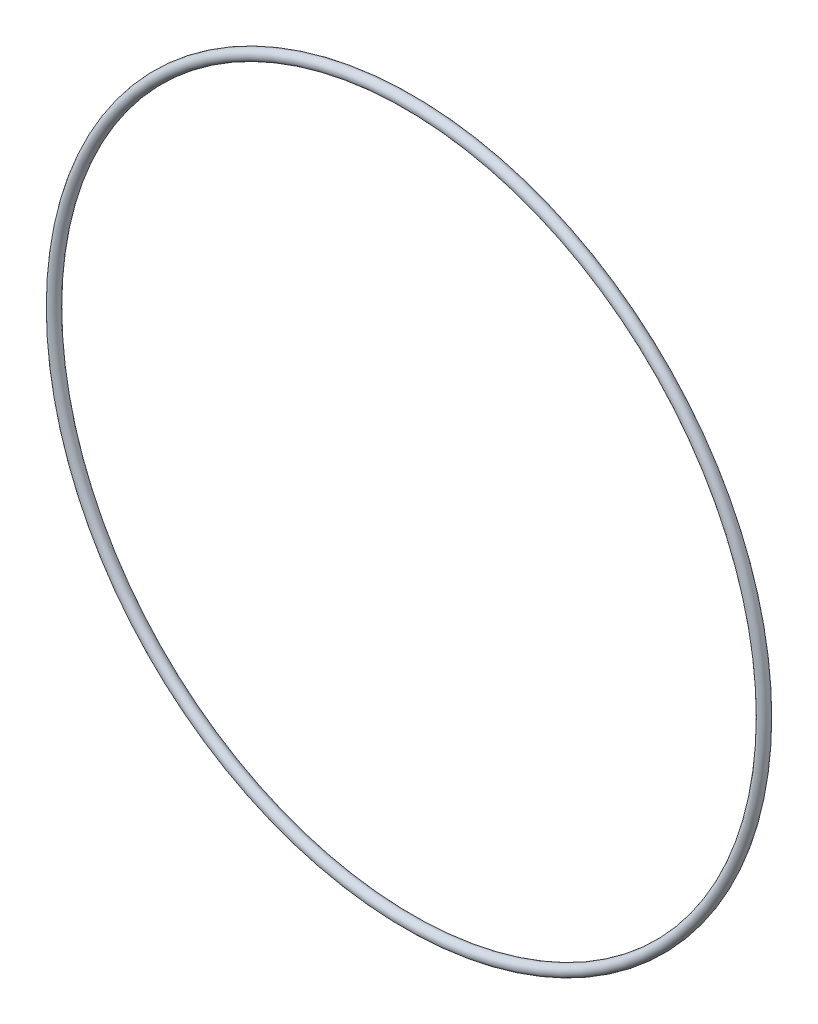
ISO-10303-21;
HEADER;
FILE_DESCRIPTION(('STEP AP214'),'2;1');
FILE_NAME('part.step','',(''),(''),'','','');
FILE_SCHEMA(('AUTOMOTIVE_DESIGN { 1 0 10303 214 1 1 1 1 }'));
ENDSEC;
DATA;
#1=APPLICATION_CONTEXT('core data for automotive mechanical design processes');
#2=APPLICATION_PROTOCOL_DEFINITION('international standard','automotive_design',2000,#1);
#3=PRODUCT_CONTEXT('',#1,'mechanical');
#4=PRODUCT('Part','Part','',(#3));
#5=PRODUCT_RELATED_PRODUCT_CATEGORY('part','',(#4));
#6=PRODUCT_DEFINITION_FORMATION('','',#4);
#7=PRODUCT_DEFINITION_CONTEXT('part definition',#1,'design');
#8=PRODUCT_DEFINITION('design','',#6,#7);
#9=PRODUCT_DEFINITION_SHAPE('','',#8);
#10=(LENGTH_UNIT() NAMED_UNIT(*) SI_UNIT(.MILLI.,.METRE.));
#11=(NAMED_UNIT(*) PLANE_ANGLE_UNIT() SI_UNIT($,.RADIAN.));
#12=(NAMED_UNIT(*) SI_UNIT($,.STERADIAN.) SOLID_ANGLE_UNIT());
#13=UNCERTAINTY_MEASURE_WITH_UNIT(LENGTH_MEASURE(1.E-05),#10,'distance_accuracy_value','');
#14=(GEOMETRIC_REPRESENTATION_CONTEXT(3) GLOBAL_UNCERTAINTY_ASSIGNED_CONTEXT((#13)) GLOBAL_UNIT_ASSIGNED_CONTEXT((#10,
#11,#12)) REPRESENTATION_CONTEXT('',''));
#15=CARTESIAN_POINT('',(0.,0.,0.));
#16=DIRECTION('',(0.,0.,1.));
#17=DIRECTION('',(1.,0.,0.));
#18=AXIS2_PLACEMENT_3D('',#15,#16,#17);
#19=CARTESIAN_POINT('',(0.,0.,72.8));
#20=DIRECTION('',(0.,0.,1.));
#21=DIRECTION('',(1.,0.,0.));
#22=AXIS2_PLACEMENT_3D('',#19,#20,#21);
#23=TOROIDAL_SURFACE('',#22,81.15,1.25);
#24=CARTESIAN_POINT('',(0.,0.,72.8));
#25=DIRECTION('',(0.,0.,1.));
#26=DIRECTION('',(1.,0.,0.));
#27=AXIS2_PLACEMENT_3D('',#24,#25,#26);
#28=CIRCLE('',#27,82.4);
#29=CARTESIAN_POINT('',(82.4,0.,72.8));
#30=VERTEX_POINT('',#29);
#31=EDGE_CURVE('E21',#30,#30,#28,.T.);
#32=ORIENTED_EDGE('',*,*,#31,.F.);
#33=CARTESIAN_POINT('',(81.15,0.,72.8));
#34=DIRECTION('',(0.,-1.,0.));
#35=DIRECTION('',(1.,0.,0.));
#36=AXIS2_PLACEMENT_3D('',#33,#34,#35);
#37=CIRCLE('',#36,1.25);
#38=EDGE_CURVE('E9',#30,#30,#37,.T.);
#39=ORIENTED_EDGE('',*,*,#38,.F.);
#40=ORIENTED_EDGE('',*,*,#31,.T.);
#41=ORIENTED_EDGE('',*,*,#38,.T.);
#42=EDGE_LOOP('',(#32,#39,#40,#41));
#43=FACE_BOUND('',#42,.T.);
#44=ADVANCED_FACE('F15',(#43),#23,.T.);
#45=CLOSED_SHELL('',(#44));
#46=MANIFOLD_SOLID_BREP('B1',#45);
#47=ADVANCED_BREP_SHAPE_REPRESENTATION('',(#18,#46),#14);
#48=SHAPE_DEFINITION_REPRESENTATION(#9,#47);
ENDSEC;
END-ISO-10303-21;
